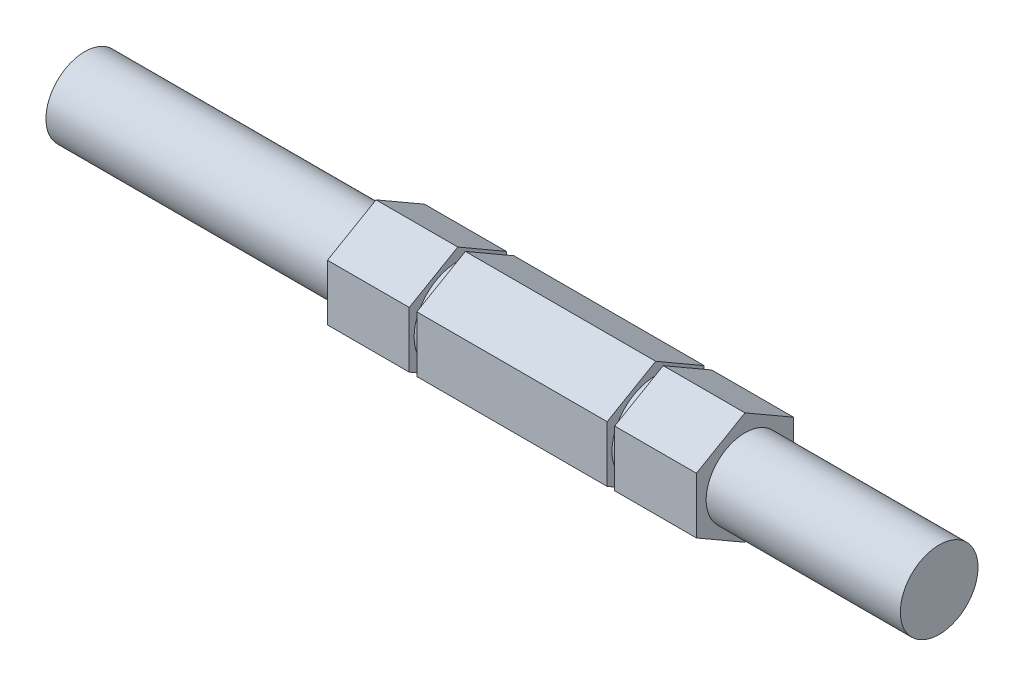
ISO-10303-21;
HEADER;
FILE_DESCRIPTION(('STEP AP214'),'2;1');
FILE_NAME('part.step','',(''),(''),'','','');
FILE_SCHEMA(('AUTOMOTIVE_DESIGN { 1 0 10303 214 1 1 1 1 }'));
ENDSEC;
DATA;
#1=APPLICATION_CONTEXT('core data for automotive mechanical design processes');
#2=APPLICATION_PROTOCOL_DEFINITION('international standard','automotive_design',2000,#1);
#3=PRODUCT_CONTEXT('',#1,'mechanical');
#4=PRODUCT('Part','Part','',(#3));
#5=PRODUCT_RELATED_PRODUCT_CATEGORY('part','',(#4));
#6=PRODUCT_DEFINITION_FORMATION('','',#4);
#7=PRODUCT_DEFINITION_CONTEXT('part definition',#1,'design');
#8=PRODUCT_DEFINITION('design','',#6,#7);
#9=PRODUCT_DEFINITION_SHAPE('','',#8);
#10=(LENGTH_UNIT() NAMED_UNIT(*) SI_UNIT(.MILLI.,.METRE.));
#11=(NAMED_UNIT(*) PLANE_ANGLE_UNIT() SI_UNIT($,.RADIAN.));
#12=(NAMED_UNIT(*) SI_UNIT($,.STERADIAN.) SOLID_ANGLE_UNIT());
#13=UNCERTAINTY_MEASURE_WITH_UNIT(LENGTH_MEASURE(1.E-05),#10,'distance_accuracy_value','');
#14=(GEOMETRIC_REPRESENTATION_CONTEXT(3) GLOBAL_UNCERTAINTY_ASSIGNED_CONTEXT((#13)) GLOBAL_UNIT_ASSIGNED_CONTEXT((#10,
#11,#12)) REPRESENTATION_CONTEXT('',''));
#15=CARTESIAN_POINT('',(0.,0.,0.));
#16=DIRECTION('',(0.,0.,1.));
#17=DIRECTION('',(1.,0.,0.));
#18=AXIS2_PLACEMENT_3D('',#15,#16,#17);
#19=CARTESIAN_POINT('',(48.26,-3.66617420935412,6.35000000000001));
#20=DIRECTION('',(0.,0.866025403784438,-0.5));
#21=DIRECTION('',(0.,0.5,0.866025403784439));
#22=AXIS2_PLACEMENT_3D('',#19,#20,#21);
#23=PLANE('',#22);
#24=DIRECTION('',(-1.,0.,0.));
#25=VECTOR('',#24,1.);
#26=CARTESIAN_POINT('',(48.26,-7.33234841870825,0.));
#27=LINE('',#26,#25);
#28=CARTESIAN_POINT('',(36.576,-7.33234841870825,0.));
#29=VERTEX_POINT('',#28);
#30=CARTESIAN_POINT('',(11.684,-7.33234841870825,0.));
#31=VERTEX_POINT('',#30);
#32=EDGE_CURVE('E165',#29,#31,#27,.T.);
#33=ORIENTED_EDGE('',*,*,#32,.F.);
#34=DIRECTION('',(0.,0.5,0.866025403784439));
#35=VECTOR('',#34,1.);
#36=CARTESIAN_POINT('',(36.576,-3.66617420935412,6.35000000000001));
#37=LINE('',#36,#35);
#38=CARTESIAN_POINT('',(36.576,-3.66617420935413,6.35000000000001));
#39=VERTEX_POINT('',#38);
#40=EDGE_CURVE('E154',#29,#39,#37,.T.);
#41=ORIENTED_EDGE('',*,*,#40,.T.);
#42=DIRECTION('',(-1.,0.,0.));
#43=VECTOR('',#42,1.);
#44=CARTESIAN_POINT('',(48.26,-3.66617420935412,6.35000000000001));
#45=LINE('',#44,#43);
#46=CARTESIAN_POINT('',(11.684,-3.66617420935412,6.35000000000001));
#47=VERTEX_POINT('',#46);
#48=EDGE_CURVE('E163',#39,#47,#45,.T.);
#49=ORIENTED_EDGE('',*,*,#48,.T.);
#50=DIRECTION('',(0.,0.5,0.866025403784439));
#51=VECTOR('',#50,1.);
#52=CARTESIAN_POINT('',(11.684,-3.66617420935412,6.35000000000001));
#53=LINE('',#52,#51);
#54=EDGE_CURVE('E218',#31,#47,#53,.T.);
#55=ORIENTED_EDGE('',*,*,#54,.F.);
#56=EDGE_LOOP('',(#33,#41,#49,#55));
#57=FACE_BOUND('',#56,.T.);
#58=ADVANCED_FACE('F32',(#57),#23,.F.);
#59=CARTESIAN_POINT('',(48.26,-7.33234841870825,0.));
#60=DIRECTION('',(0.,0.866025403784439,0.5));
#61=DIRECTION('',(0.,-0.5,0.866025403784439));
#62=AXIS2_PLACEMENT_3D('',#59,#60,#61);
#63=PLANE('',#62);
#64=DIRECTION('',(-1.,0.,0.));
#65=VECTOR('',#64,1.);
#66=CARTESIAN_POINT('',(48.26,-3.66617420935412,-6.35));
#67=LINE('',#66,#65);
#68=CARTESIAN_POINT('',(36.576,-3.66617420935412,-6.35));
#69=VERTEX_POINT('',#68);
#70=CARTESIAN_POINT('',(11.684,-3.66617420935412,-6.35));
#71=VERTEX_POINT('',#70);
#72=EDGE_CURVE('E201',#69,#71,#67,.T.);
#73=ORIENTED_EDGE('',*,*,#72,.F.);
#74=DIRECTION('',(0.,-0.5,0.866025403784439));
#75=VECTOR('',#74,1.);
#76=CARTESIAN_POINT('',(36.576,-7.33234841870825,0.));
#77=LINE('',#76,#75);
#78=EDGE_CURVE('E167',#69,#29,#77,.T.);
#79=ORIENTED_EDGE('',*,*,#78,.T.);
#80=ORIENTED_EDGE('',*,*,#32,.T.);
#81=DIRECTION('',(0.,-0.5,0.866025403784439));
#82=VECTOR('',#81,1.);
#83=CARTESIAN_POINT('',(11.684,-7.33234841870825,0.));
#84=LINE('',#83,#82);
#85=EDGE_CURVE('E233',#71,#31,#84,.T.);
#86=ORIENTED_EDGE('',*,*,#85,.F.);
#87=EDGE_LOOP('',(#73,#79,#80,#86));
#88=FACE_BOUND('',#87,.T.);
#89=ADVANCED_FACE('F371',(#88),#63,.F.);
#90=CARTESIAN_POINT('',(48.26,-3.66617420935412,-6.35));
#91=DIRECTION('',(0.,0.,1.));
#92=DIRECTION('',(1.,0.,0.));
#93=AXIS2_PLACEMENT_3D('',#90,#91,#92);
#94=PLANE('',#93);
#95=DIRECTION('',(-1.,0.,0.));
#96=VECTOR('',#95,1.);
#97=CARTESIAN_POINT('',(48.26,3.66617420935414,-6.35));
#98=LINE('',#97,#96);
#99=CARTESIAN_POINT('',(36.576,3.66617420935414,-6.35));
#100=VERTEX_POINT('',#99);
#101=CARTESIAN_POINT('',(11.684,3.66617420935414,-6.35));
#102=VERTEX_POINT('',#101);
#103=EDGE_CURVE('E196',#100,#102,#98,.T.);
#104=ORIENTED_EDGE('',*,*,#103,.F.);
#105=DIRECTION('',(0.,-1.,0.));
#106=VECTOR('',#105,1.);
#107=CARTESIAN_POINT('',(36.576,-3.66617420935412,-6.35));
#108=LINE('',#107,#106);
#109=EDGE_CURVE('E322',#100,#69,#108,.T.);
#110=ORIENTED_EDGE('',*,*,#109,.T.);
#111=ORIENTED_EDGE('',*,*,#72,.T.);
#112=DIRECTION('',(0.,-1.,0.));
#113=VECTOR('',#112,1.);
#114=CARTESIAN_POINT('',(11.684,-3.66617420935412,-6.35));
#115=LINE('',#114,#113);
#116=EDGE_CURVE('E225',#102,#71,#115,.T.);
#117=ORIENTED_EDGE('',*,*,#116,.F.);
#118=EDGE_LOOP('',(#104,#110,#111,#117));
#119=FACE_BOUND('',#118,.T.);
#120=ADVANCED_FACE('F377',(#119),#94,.F.);
#121=CARTESIAN_POINT('',(48.26,3.66617420935414,-6.35));
#122=DIRECTION('',(0.,-0.866025403784439,0.5));
#123=DIRECTION('',(0.,-0.5,-0.866025403784439));
#124=AXIS2_PLACEMENT_3D('',#121,#122,#123);
#125=PLANE('',#124);
#126=DIRECTION('',(-1.,0.,0.));
#127=VECTOR('',#126,1.);
#128=CARTESIAN_POINT('',(48.26,7.33234841870826,0.));
#129=LINE('',#128,#127);
#130=CARTESIAN_POINT('',(36.576,7.33234841870826,0.));
#131=VERTEX_POINT('',#130);
#132=CARTESIAN_POINT('',(11.684,7.33234841870826,0.));
#133=VERTEX_POINT('',#132);
#134=EDGE_CURVE('E191',#131,#133,#129,.T.);
#135=ORIENTED_EDGE('',*,*,#134,.F.);
#136=DIRECTION('',(0.,-0.5,-0.866025403784439));
#137=VECTOR('',#136,1.);
#138=CARTESIAN_POINT('',(36.576,3.66617420935414,-6.35));
#139=LINE('',#138,#137);
#140=EDGE_CURVE('E325',#131,#100,#139,.T.);
#141=ORIENTED_EDGE('',*,*,#140,.T.);
#142=ORIENTED_EDGE('',*,*,#103,.T.);
#143=DIRECTION('',(0.,-0.5,-0.866025403784439));
#144=VECTOR('',#143,1.);
#145=CARTESIAN_POINT('',(11.684,3.66617420935414,-6.35));
#146=LINE('',#145,#144);
#147=EDGE_CURVE('E222',#133,#102,#146,.T.);
#148=ORIENTED_EDGE('',*,*,#147,.F.);
#149=EDGE_LOOP('',(#135,#141,#142,#148));
#150=FACE_BOUND('',#149,.T.);
#151=ADVANCED_FACE('F382',(#150),#125,.F.);
#152=CARTESIAN_POINT('',(48.26,7.33234841870826,0.));
#153=DIRECTION('',(0.,-0.866025403784439,-0.5));
#154=DIRECTION('',(0.,0.5,-0.866025403784439));
#155=AXIS2_PLACEMENT_3D('',#152,#153,#154);
#156=PLANE('',#155);
#157=DIRECTION('',(-1.,0.,0.));
#158=VECTOR('',#157,1.);
#159=CARTESIAN_POINT('',(48.26,3.66617420935413,6.35000000000001));
#160=LINE('',#159,#158);
#161=CARTESIAN_POINT('',(36.576,3.66617420935413,6.35000000000001));
#162=VERTEX_POINT('',#161);
#163=CARTESIAN_POINT('',(11.684,3.66617420935413,6.35000000000001));
#164=VERTEX_POINT('',#163);
#165=EDGE_CURVE('E186',#162,#164,#160,.T.);
#166=ORIENTED_EDGE('',*,*,#165,.F.);
#167=DIRECTION('',(0.,0.5,-0.866025403784439));
#168=VECTOR('',#167,1.);
#169=CARTESIAN_POINT('',(36.576,7.33234841870826,0.));
#170=LINE('',#169,#168);
#171=EDGE_CURVE('E46',#162,#131,#170,.T.);
#172=ORIENTED_EDGE('',*,*,#171,.T.);
#173=ORIENTED_EDGE('',*,*,#134,.T.);
#174=DIRECTION('',(0.,0.5,-0.866025403784439));
#175=VECTOR('',#174,1.);
#176=CARTESIAN_POINT('',(11.684,7.33234841870826,0.));
#177=LINE('',#176,#175);
#178=EDGE_CURVE('E215',#164,#133,#177,.T.);
#179=ORIENTED_EDGE('',*,*,#178,.F.);
#180=EDGE_LOOP('',(#166,#172,#173,#179));
#181=FACE_BOUND('',#180,.T.);
#182=ADVANCED_FACE('F220',(#181),#156,.F.);
#183=CARTESIAN_POINT('',(48.26,3.66617420935413,6.35000000000001));
#184=DIRECTION('',(0.,0.,-1.));
#185=DIRECTION('',(0.,1.,0.));
#186=AXIS2_PLACEMENT_3D('',#183,#184,#185);
#187=PLANE('',#186);
#188=ORIENTED_EDGE('',*,*,#48,.F.);
#189=DIRECTION('',(0.,1.,0.));
#190=VECTOR('',#189,1.);
#191=CARTESIAN_POINT('',(36.576,3.66617420935413,6.35000000000001));
#192=LINE('',#191,#190);
#193=EDGE_CURVE('E39',#39,#162,#192,.T.);
#194=ORIENTED_EDGE('',*,*,#193,.T.);
#195=ORIENTED_EDGE('',*,*,#165,.T.);
#196=DIRECTION('',(0.,1.,0.));
#197=VECTOR('',#196,1.);
#198=CARTESIAN_POINT('',(11.684,3.66617420935413,6.35000000000001));
#199=LINE('',#198,#197);
#200=EDGE_CURVE('E159',#47,#164,#199,.T.);
#201=ORIENTED_EDGE('',*,*,#200,.F.);
#202=EDGE_LOOP('',(#188,#194,#195,#201));
#203=FACE_BOUND('',#202,.T.);
#204=ADVANCED_FACE('F170',(#203),#187,.F.);
#205=CARTESIAN_POINT('',(11.684,0.,-5.715));
#206=DIRECTION('',(-1.,0.,0.));
#207=DIRECTION('',(0.,0.,1.));
#208=AXIS2_PLACEMENT_3D('',#205,#206,#207);
#209=PLANE('',#208);
#210=CARTESIAN_POINT('',(11.684,0.,0.));
#211=DIRECTION('',(-1.,0.,0.));
#212=DIRECTION('',(0.,0.,1.));
#213=AXIS2_PLACEMENT_3D('',#210,#211,#212);
#214=CIRCLE('',#213,5.715);
#215=CARTESIAN_POINT('',(11.684,0.,5.715));
#216=VERTEX_POINT('',#215);
#217=EDGE_CURVE('E303',#216,#216,#214,.T.);
#218=ORIENTED_EDGE('',*,*,#217,.F.);
#219=EDGE_LOOP('',(#218));
#220=FACE_BOUND('',#219,.T.);
#221=ORIENTED_EDGE('',*,*,#54,.T.);
#222=ORIENTED_EDGE('',*,*,#200,.T.);
#223=ORIENTED_EDGE('',*,*,#178,.T.);
#224=ORIENTED_EDGE('',*,*,#147,.T.);
#225=ORIENTED_EDGE('',*,*,#116,.T.);
#226=ORIENTED_EDGE('',*,*,#85,.T.);
#227=EDGE_LOOP('',(#221,#222,#223,#224,#225,#226));
#228=FACE_BOUND('',#227,.T.);
#229=ADVANCED_FACE('F213',(#220,#228),#209,.T.);
#230=CARTESIAN_POINT('',(10.6934,0.,-7.93381997086933));
#231=DIRECTION('',(1.,0.,0.));
#232=DIRECTION('',(0.,0.,-1.));
#233=AXIS2_PLACEMENT_3D('',#230,#231,#232);
#234=PLANE('',#233);
#235=CARTESIAN_POINT('',(10.6934,0.,0.));
#236=DIRECTION('',(-1.,0.,0.));
#237=DIRECTION('',(0.,0.,1.));
#238=AXIS2_PLACEMENT_3D('',#235,#236,#237);
#239=CIRCLE('',#238,5.715);
#240=CARTESIAN_POINT('',(10.6934,0.,5.715));
#241=VERTEX_POINT('',#240);
#242=EDGE_CURVE('E306',#241,#241,#239,.T.);
#243=ORIENTED_EDGE('',*,*,#242,.T.);
#244=EDGE_LOOP('',(#243));
#245=FACE_BOUND('',#244,.T.);
#246=DIRECTION('',(0.,-0.5,-0.866025403784439));
#247=VECTOR('',#246,1.);
#248=CARTESIAN_POINT('',(10.6934,-3.66617420935412,6.35000000000001));
#249=LINE('',#248,#247);
#250=CARTESIAN_POINT('',(10.6934,-3.66617420935413,6.35000000000001));
#251=VERTEX_POINT('',#250);
#252=CARTESIAN_POINT('',(10.6934,-7.33234841870825,0.));
#253=VERTEX_POINT('',#252);
#254=EDGE_CURVE('E223',#251,#253,#249,.T.);
#255=ORIENTED_EDGE('',*,*,#254,.T.);
#256=DIRECTION('',(0.,0.5,-0.866025403784439));
#257=VECTOR('',#256,1.);
#258=CARTESIAN_POINT('',(10.6934,-7.33234841870825,0.));
#259=LINE('',#258,#257);
#260=CARTESIAN_POINT('',(10.6934,-3.66617420935412,-6.35));
#261=VERTEX_POINT('',#260);
#262=EDGE_CURVE('E227',#253,#261,#259,.T.);
#263=ORIENTED_EDGE('',*,*,#262,.T.);
#264=DIRECTION('',(0.,1.,0.));
#265=VECTOR('',#264,1.);
#266=CARTESIAN_POINT('',(10.6934,-3.66617420935412,-6.35));
#267=LINE('',#266,#265);
#268=CARTESIAN_POINT('',(10.6934,3.66617420935414,-6.35));
#269=VERTEX_POINT('',#268);
#270=EDGE_CURVE('E296',#261,#269,#267,.T.);
#271=ORIENTED_EDGE('',*,*,#270,.T.);
#272=DIRECTION('',(0.,0.5,0.866025403784439));
#273=VECTOR('',#272,1.);
#274=CARTESIAN_POINT('',(10.6934,3.66617420935414,-6.35));
#275=LINE('',#274,#273);
#276=CARTESIAN_POINT('',(10.6934,7.33234841870826,0.));
#277=VERTEX_POINT('',#276);
#278=EDGE_CURVE('E297',#269,#277,#275,.T.);
#279=ORIENTED_EDGE('',*,*,#278,.T.);
#280=DIRECTION('',(0.,-0.5,0.866025403784439));
#281=VECTOR('',#280,1.);
#282=CARTESIAN_POINT('',(10.6934,7.33234841870826,0.));
#283=LINE('',#282,#281);
#284=CARTESIAN_POINT('',(10.6934,3.66617420935413,6.35000000000001));
#285=VERTEX_POINT('',#284);
#286=EDGE_CURVE('E301',#277,#285,#283,.T.);
#287=ORIENTED_EDGE('',*,*,#286,.T.);
#288=DIRECTION('',(0.,-1.,0.));
#289=VECTOR('',#288,1.);
#290=CARTESIAN_POINT('',(10.6934,3.66617420935413,6.35000000000001));
#291=LINE('',#290,#289);
#292=EDGE_CURVE('E208',#285,#251,#291,.T.);
#293=ORIENTED_EDGE('',*,*,#292,.T.);
#294=EDGE_LOOP('',(#255,#263,#271,#279,#287,#293));
#295=FACE_BOUND('',#294,.T.);
#296=ADVANCED_FACE('F291',(#245,#295),#234,.T.);
#297=CARTESIAN_POINT('',(-57.5945603764723,0.,0.));
#298=DIRECTION('',(-1.,0.,0.));
#299=DIRECTION('',(0.,0.,1.));
#300=AXIS2_PLACEMENT_3D('',#297,#298,#299);
#301=CYLINDRICAL_SURFACE('',#300,5.715);
#302=ORIENTED_EDGE('',*,*,#217,.T.);
#303=EDGE_LOOP('',(#302));
#304=FACE_BOUND('',#303,.T.);
#305=ORIENTED_EDGE('',*,*,#242,.F.);
#306=EDGE_LOOP('',(#305));
#307=FACE_BOUND('',#306,.T.);
#308=ADVANCED_FACE('F439',(#304,#307),#301,.T.);
#309=CARTESIAN_POINT('',(-38.1,0.,0.));
#310=DIRECTION('',(-1.,0.,0.));
#311=DIRECTION('',(0.,0.,1.));
#312=AXIS2_PLACEMENT_3D('',#309,#310,#311);
#313=PLANE('',#312);
#314=CARTESIAN_POINT('',(-38.1,0.,0.));
#315=DIRECTION('',(-1.,0.,0.));
#316=DIRECTION('',(0.,0.,1.));
#317=AXIS2_PLACEMENT_3D('',#314,#315,#316);
#318=CIRCLE('',#317,5.08);
#319=CARTESIAN_POINT('',(-38.1,0.,-5.08));
#320=VERTEX_POINT('',#319);
#321=EDGE_CURVE('E240',#320,#320,#318,.T.);
#322=ORIENTED_EDGE('',*,*,#321,.T.);
#323=EDGE_LOOP('',(#322));
#324=FACE_BOUND('',#323,.T.);
#325=ADVANCED_FACE('F435',(#324),#313,.T.);
#326=CARTESIAN_POINT('',(-38.1,0.,0.));
#327=DIRECTION('',(1.,0.,0.));
#328=DIRECTION('',(0.,0.,-1.));
#329=AXIS2_PLACEMENT_3D('',#326,#327,#328);
#330=CYLINDRICAL_SURFACE('',#329,5.08);
#331=CARTESIAN_POINT('',(0.,0.,0.));
#332=DIRECTION('',(1.,0.,0.));
#333=DIRECTION('',(0.,0.,-1.));
#334=AXIS2_PLACEMENT_3D('',#331,#332,#333);
#335=CIRCLE('',#334,5.08);
#336=CARTESIAN_POINT('',(0.,0.,-5.08));
#337=VERTEX_POINT('',#336);
#338=EDGE_CURVE('E205',#337,#337,#335,.F.);
#339=CARTESIAN_POINT('',(-38.1,0.,-5.08));
#340=CARTESIAN_POINT('',(-37.703125,0.,-5.08));
#341=CARTESIAN_POINT('',(-37.30625,0.,-5.08));
#342=CARTESIAN_POINT('',(-36.5125,0.,-5.08));
#343=CARTESIAN_POINT('',(-36.115625,0.,-5.08));
#344=CARTESIAN_POINT('',(-35.321875,0.,-5.08));
#345=CARTESIAN_POINT('',(-34.925,0.,-5.08));
#346=CARTESIAN_POINT('',(-34.13125,0.,-5.08));
#347=CARTESIAN_POINT('',(-33.734375,0.,-5.08));
#348=CARTESIAN_POINT('',(-32.940625,0.,-5.08));
#349=CARTESIAN_POINT('',(-32.54375,0.,-5.08));
#350=CARTESIAN_POINT('',(-31.75,0.,-5.08));
#351=CARTESIAN_POINT('',(-31.353125,0.,-5.08));
#352=CARTESIAN_POINT('',(-30.559375,0.,-5.08));
#353=CARTESIAN_POINT('',(-30.1625,0.,-5.08));
#354=CARTESIAN_POINT('',(-29.36875,0.,-5.08));
#355=CARTESIAN_POINT('',(-28.971875,0.,-5.08));
#356=CARTESIAN_POINT('',(-28.178125,0.,-5.08));
#357=CARTESIAN_POINT('',(-27.78125,0.,-5.08));
#358=CARTESIAN_POINT('',(-26.9875,0.,-5.08));
#359=CARTESIAN_POINT('',(-26.590625,0.,-5.08));
#360=CARTESIAN_POINT('',(-25.796875,0.,-5.08));
#361=CARTESIAN_POINT('',(-25.4,0.,-5.08));
#362=CARTESIAN_POINT('',(-24.60625,0.,-5.08));
#363=CARTESIAN_POINT('',(-24.209375,0.,-5.08));
#364=CARTESIAN_POINT('',(-23.415625,0.,-5.08));
#365=CARTESIAN_POINT('',(-23.01875,0.,-5.08));
#366=CARTESIAN_POINT('',(-22.225,0.,-5.08));
#367=CARTESIAN_POINT('',(-21.828125,0.,-5.08));
#368=CARTESIAN_POINT('',(-21.034375,0.,-5.08));
#369=CARTESIAN_POINT('',(-20.6375,0.,-5.08));
#370=CARTESIAN_POINT('',(-19.84375,0.,-5.08));
#371=CARTESIAN_POINT('',(-19.446875,0.,-5.08));
#372=CARTESIAN_POINT('',(-18.653125,0.,-5.08));
#373=CARTESIAN_POINT('',(-18.25625,0.,-5.08));
#374=CARTESIAN_POINT('',(-17.4625,0.,-5.08));
#375=CARTESIAN_POINT('',(-17.065625,0.,-5.08));
#376=CARTESIAN_POINT('',(-16.271875,0.,-5.08));
#377=CARTESIAN_POINT('',(-15.875,0.,-5.08));
#378=CARTESIAN_POINT('',(-15.08125,0.,-5.08));
#379=CARTESIAN_POINT('',(-14.684375,0.,-5.08));
#380=CARTESIAN_POINT('',(-13.890625,0.,-5.08));
#381=CARTESIAN_POINT('',(-13.49375,0.,-5.08));
#382=CARTESIAN_POINT('',(-12.7,0.,-5.08));
#383=CARTESIAN_POINT('',(-12.303125,0.,-5.08));
#384=CARTESIAN_POINT('',(-11.509375,0.,-5.08));
#385=CARTESIAN_POINT('',(-11.1125,0.,-5.08));
#386=CARTESIAN_POINT('',(-10.31875,0.,-5.08));
#387=CARTESIAN_POINT('',(-9.921875,0.,-5.08));
#388=CARTESIAN_POINT('',(-9.128125,0.,-5.08));
#389=CARTESIAN_POINT('',(-8.73125,0.,-5.08));
#390=CARTESIAN_POINT('',(-7.9375,0.,-5.08));
#391=CARTESIAN_POINT('',(-7.540625,0.,-5.08));
#392=CARTESIAN_POINT('',(-6.746875,0.,-5.08));
#393=CARTESIAN_POINT('',(-6.35,0.,-5.08));
#394=CARTESIAN_POINT('',(-5.55625,0.,-5.08));
#395=CARTESIAN_POINT('',(-5.159375,0.,-5.08));
#396=CARTESIAN_POINT('',(-4.365625,0.,-5.08));
#397=CARTESIAN_POINT('',(-3.96875,0.,-5.08));
#398=CARTESIAN_POINT('',(-3.175,0.,-5.08));
#399=CARTESIAN_POINT('',(-2.778125,0.,-5.08));
#400=CARTESIAN_POINT('',(-1.984375,0.,-5.08));
#401=CARTESIAN_POINT('',(-1.5875,0.,-5.08));
#402=CARTESIAN_POINT('',(-0.79375,0.,-5.08));
#403=CARTESIAN_POINT('',(-0.396875,0.,-5.08));
#404=CARTESIAN_POINT('',(0.,0.,-5.08));
#405=B_SPLINE_CURVE_WITH_KNOTS('',3,(#339,#340,#341,#342,#343,#344,#345,#346,#347,#348,#349,
#350,#351,#352,#353,#354,#355,#356,#357,#358,#359,#360,#361,#362,#363,#364,#365,#366,#367,#368,
#369,#370,#371,#372,#373,#374,#375,#376,#377,#378,#379,#380,#381,#382,#383,#384,#385,#386,#387,
#388,#389,#390,#391,#392,#393,#394,#395,#396,#397,#398,#399,#400,#401,#402,#403,#404),
.UNSPECIFIED.,.F.,.F.,(4,2,2,2,2,2,2,2,2,2,2,2,2,2,2,2,2,2,2,2,2,2,2,2,2,2,2,2,2,2,2,2,4),(0.,
1.19062499999999,2.38124999999999,3.571875,4.7625,5.953125,7.14375,8.33437499999999,9.525,
10.715625,11.90625,13.096875,14.2875,15.478125,16.66875,17.859375,19.05,20.240625,21.43125,
22.621875,23.8125,25.003125,26.19375,27.384375,28.575,29.765625,30.95625,32.146875,33.3375,
34.528125,35.71875,36.909375,38.1),.UNSPECIFIED.);
#406=EDGE_CURVE('BSEAM429',#320,#337,#405,.T.);
#407=ORIENTED_EDGE('',*,*,#321,.F.);
#408=ORIENTED_EDGE('',*,*,#338,.T.);
#409=ORIENTED_EDGE('',*,*,#406,.T.);
#410=ORIENTED_EDGE('',*,*,#406,.F.);
#411=EDGE_LOOP('',(#407,#409,#408,#410));
#412=FACE_BOUND('',#411,.T.);
#413=ADVANCED_FACE('F429',(#412),#330,.T.);
#414=CARTESIAN_POINT('',(0.,0.,0.));
#415=DIRECTION('',(1.,0.,0.));
#416=DIRECTION('',(0.,0.,-1.));
#417=AXIS2_PLACEMENT_3D('',#414,#415,#416);
#418=PLANE('',#417);
#419=DIRECTION('',(0.,-0.5,-0.866025403784439));
#420=VECTOR('',#419,1.);
#421=CARTESIAN_POINT('',(0.,-3.66617420935412,6.35000000000001));
#422=LINE('',#421,#420);
#423=CARTESIAN_POINT('',(0.,-3.66617420935412,6.35000000000001));
#424=VERTEX_POINT('',#423);
#425=CARTESIAN_POINT('',(0.,-7.33234841870825,0.));
#426=VERTEX_POINT('',#425);
#427=EDGE_CURVE('E245',#424,#426,#422,.T.);
#428=ORIENTED_EDGE('',*,*,#427,.F.);
#429=DIRECTION('',(0.,-1.,0.));
#430=VECTOR('',#429,1.);
#431=CARTESIAN_POINT('',(0.,3.66617420935413,6.35000000000001));
#432=LINE('',#431,#430);
#433=CARTESIAN_POINT('',(0.,3.66617420935413,6.35000000000001));
#434=VERTEX_POINT('',#433);
#435=EDGE_CURVE('E180',#434,#424,#432,.T.);
#436=ORIENTED_EDGE('',*,*,#435,.F.);
#437=DIRECTION('',(0.,-0.5,0.866025403784439));
#438=VECTOR('',#437,1.);
#439=CARTESIAN_POINT('',(0.,7.33234841870826,0.));
#440=LINE('',#439,#438);
#441=CARTESIAN_POINT('',(0.,7.33234841870826,0.));
#442=VERTEX_POINT('',#441);
#443=EDGE_CURVE('E268',#442,#434,#440,.T.);
#444=ORIENTED_EDGE('',*,*,#443,.F.);
#445=DIRECTION('',(0.,0.5,0.866025403784439));
#446=VECTOR('',#445,1.);
#447=CARTESIAN_POINT('',(0.,3.66617420935414,-6.35));
#448=LINE('',#447,#446);
#449=CARTESIAN_POINT('',(0.,3.66617420935414,-6.35));
#450=VERTEX_POINT('',#449);
#451=EDGE_CURVE('E266',#450,#442,#448,.T.);
#452=ORIENTED_EDGE('',*,*,#451,.F.);
#453=DIRECTION('',(0.,1.,0.));
#454=VECTOR('',#453,1.);
#455=CARTESIAN_POINT('',(0.,-3.66617420935412,-6.35));
#456=LINE('',#455,#454);
#457=CARTESIAN_POINT('',(0.,-3.66617420935412,-6.35));
#458=VERTEX_POINT('',#457);
#459=EDGE_CURVE('E263',#458,#450,#456,.T.);
#460=ORIENTED_EDGE('',*,*,#459,.F.);
#461=DIRECTION('',(0.,0.5,-0.866025403784439));
#462=VECTOR('',#461,1.);
#463=CARTESIAN_POINT('',(0.,-7.33234841870825,0.));
#464=LINE('',#463,#462);
#465=EDGE_CURVE('E260',#426,#458,#464,.T.);
#466=ORIENTED_EDGE('',*,*,#465,.F.);
#467=EDGE_LOOP('',(#428,#436,#444,#452,#460,#466));
#468=FACE_BOUND('',#467,.T.);
#469=ORIENTED_EDGE('',*,*,#338,.F.);
#470=EDGE_LOOP('',(#469));
#471=FACE_BOUND('',#470,.T.);
#472=ADVANCED_FACE('F282',(#468,#471),#418,.F.);
#473=ORIENTED_EDGE('',*,*,#292,.F.);
#474=EDGE_CURVE('E176',#285,#434,#160,.T.);
#475=ORIENTED_EDGE('',*,*,#474,.T.);
#476=ORIENTED_EDGE('',*,*,#435,.T.);
#477=EDGE_CURVE('E173',#251,#424,#45,.T.);
#478=ORIENTED_EDGE('',*,*,#477,.F.);
#479=EDGE_LOOP('',(#473,#475,#476,#478));
#480=FACE_BOUND('',#479,.T.);
#481=ADVANCED_FACE('F279',(#480),#187,.F.);
#482=ORIENTED_EDGE('',*,*,#286,.F.);
#483=EDGE_CURVE('E185',#277,#442,#129,.T.);
#484=ORIENTED_EDGE('',*,*,#483,.T.);
#485=ORIENTED_EDGE('',*,*,#443,.T.);
#486=ORIENTED_EDGE('',*,*,#474,.F.);
#487=EDGE_LOOP('',(#482,#484,#485,#486));
#488=FACE_BOUND('',#487,.T.);
#489=ADVANCED_FACE('F396',(#488),#156,.F.);
#490=ORIENTED_EDGE('',*,*,#278,.F.);
#491=EDGE_CURVE('E190',#269,#450,#98,.T.);
#492=ORIENTED_EDGE('',*,*,#491,.T.);
#493=ORIENTED_EDGE('',*,*,#451,.T.);
#494=ORIENTED_EDGE('',*,*,#483,.F.);
#495=EDGE_LOOP('',(#490,#492,#493,#494));
#496=FACE_BOUND('',#495,.T.);
#497=ADVANCED_FACE('F391',(#496),#125,.F.);
#498=ORIENTED_EDGE('',*,*,#270,.F.);
#499=EDGE_CURVE('E195',#261,#458,#67,.T.);
#500=ORIENTED_EDGE('',*,*,#499,.T.);
#501=ORIENTED_EDGE('',*,*,#459,.T.);
#502=ORIENTED_EDGE('',*,*,#491,.F.);
#503=EDGE_LOOP('',(#498,#500,#501,#502));
#504=FACE_BOUND('',#503,.T.);
#505=ADVANCED_FACE('F385',(#504),#94,.F.);
#506=ORIENTED_EDGE('',*,*,#262,.F.);
#507=EDGE_CURVE('E200',#253,#426,#27,.T.);
#508=ORIENTED_EDGE('',*,*,#507,.T.);
#509=ORIENTED_EDGE('',*,*,#465,.T.);
#510=ORIENTED_EDGE('',*,*,#499,.F.);
#511=EDGE_LOOP('',(#506,#508,#509,#510));
#512=FACE_BOUND('',#511,.T.);
#513=ADVANCED_FACE('F295',(#512),#63,.F.);
#514=ORIENTED_EDGE('',*,*,#254,.F.);
#515=ORIENTED_EDGE('',*,*,#477,.T.);
#516=ORIENTED_EDGE('',*,*,#427,.T.);
#517=ORIENTED_EDGE('',*,*,#507,.F.);
#518=EDGE_LOOP('',(#514,#515,#516,#517));
#519=FACE_BOUND('',#518,.T.);
#520=ADVANCED_FACE('F288',(#519),#23,.F.);
#521=CARTESIAN_POINT('',(37.5666,0.,-7.93381997086933));
#522=DIRECTION('',(1.,0.,0.));
#523=DIRECTION('',(0.,0.,-1.));
#524=AXIS2_PLACEMENT_3D('',#521,#522,#523);
#525=PLANE('',#524);
#526=CARTESIAN_POINT('',(37.5666,0.,0.));
#527=DIRECTION('',(-1.,0.,0.));
#528=DIRECTION('',(0.,0.,1.));
#529=AXIS2_PLACEMENT_3D('',#526,#527,#528);
#530=CIRCLE('',#529,5.715);
#531=CARTESIAN_POINT('',(37.5666,0.,5.715));
#532=VERTEX_POINT('',#531);
#533=EDGE_CURVE('E332',#532,#532,#530,.T.);
#534=ORIENTED_EDGE('',*,*,#533,.F.);
#535=EDGE_LOOP('',(#534));
#536=FACE_BOUND('',#535,.T.);
#537=DIRECTION('',(0.,-1.,0.));
#538=VECTOR('',#537,1.);
#539=CARTESIAN_POINT('',(37.5666,3.66617420935413,6.35000000000001));
#540=LINE('',#539,#538);
#541=CARTESIAN_POINT('',(37.5666,3.66617420935413,6.35000000000001));
#542=VERTEX_POINT('',#541);
#543=CARTESIAN_POINT('',(37.5666,-3.66617420935412,6.35000000000001));
#544=VERTEX_POINT('',#543);
#545=EDGE_CURVE('E11',#542,#544,#540,.T.);
#546=ORIENTED_EDGE('',*,*,#545,.F.);
#547=DIRECTION('',(0.,-0.5,0.866025403784439));
#548=VECTOR('',#547,1.);
#549=CARTESIAN_POINT('',(37.5666,7.33234841870826,0.));
#550=LINE('',#549,#548);
#551=CARTESIAN_POINT('',(37.5666,7.33234841870826,0.));
#552=VERTEX_POINT('',#551);
#553=EDGE_CURVE('E166',#552,#542,#550,.T.);
#554=ORIENTED_EDGE('',*,*,#553,.F.);
#555=DIRECTION('',(0.,0.5,0.866025403784439));
#556=VECTOR('',#555,1.);
#557=CARTESIAN_POINT('',(37.5666,3.66617420935414,-6.35));
#558=LINE('',#557,#556);
#559=CARTESIAN_POINT('',(37.5666,3.66617420935414,-6.35));
#560=VERTEX_POINT('',#559);
#561=EDGE_CURVE('E316',#560,#552,#558,.T.);
#562=ORIENTED_EDGE('',*,*,#561,.F.);
#563=DIRECTION('',(0.,1.,0.));
#564=VECTOR('',#563,1.);
#565=CARTESIAN_POINT('',(37.5666,-3.66617420935412,-6.35));
#566=LINE('',#565,#564);
#567=CARTESIAN_POINT('',(37.5666,-3.66617420935412,-6.35));
#568=VERTEX_POINT('',#567);
#569=EDGE_CURVE('E313',#568,#560,#566,.T.);
#570=ORIENTED_EDGE('',*,*,#569,.F.);
#571=DIRECTION('',(0.,0.5,-0.866025403784439));
#572=VECTOR('',#571,1.);
#573=CARTESIAN_POINT('',(37.5666,-7.33234841870825,0.));
#574=LINE('',#573,#572);
#575=CARTESIAN_POINT('',(37.5666,-7.33234841870825,0.));
#576=VERTEX_POINT('',#575);
#577=EDGE_CURVE('E310',#576,#568,#574,.T.);
#578=ORIENTED_EDGE('',*,*,#577,.F.);
#579=DIRECTION('',(0.,-0.5,-0.866025403784439));
#580=VECTOR('',#579,1.);
#581=CARTESIAN_POINT('',(37.5666,-3.66617420935412,6.35000000000001));
#582=LINE('',#581,#580);
#583=EDGE_CURVE('E54',#544,#576,#582,.T.);
#584=ORIENTED_EDGE('',*,*,#583,.F.);
#585=EDGE_LOOP('',(#546,#554,#562,#570,#578,#584));
#586=FACE_BOUND('',#585,.T.);
#587=ADVANCED_FACE('F338',(#536,#586),#525,.F.);
#588=CARTESIAN_POINT('',(36.576,0.,-5.715));
#589=DIRECTION('',(-1.,0.,0.));
#590=DIRECTION('',(0.,0.,1.));
#591=AXIS2_PLACEMENT_3D('',#588,#589,#590);
#592=PLANE('',#591);
#593=CARTESIAN_POINT('',(36.576,0.,0.));
#594=DIRECTION('',(-1.,0.,0.));
#595=DIRECTION('',(0.,0.,1.));
#596=AXIS2_PLACEMENT_3D('',#593,#594,#595);
#597=CIRCLE('',#596,5.715);
#598=CARTESIAN_POINT('',(36.576,0.,5.715));
#599=VERTEX_POINT('',#598);
#600=EDGE_CURVE('E329',#599,#599,#597,.T.);
#601=ORIENTED_EDGE('',*,*,#600,.T.);
#602=EDGE_LOOP('',(#601));
#603=FACE_BOUND('',#602,.T.);
#604=ORIENTED_EDGE('',*,*,#78,.F.);
#605=ORIENTED_EDGE('',*,*,#109,.F.);
#606=ORIENTED_EDGE('',*,*,#140,.F.);
#607=ORIENTED_EDGE('',*,*,#171,.F.);
#608=ORIENTED_EDGE('',*,*,#193,.F.);
#609=ORIENTED_EDGE('',*,*,#40,.F.);
#610=EDGE_LOOP('',(#604,#605,#606,#607,#608,#609));
#611=FACE_BOUND('',#610,.T.);
#612=ADVANCED_FACE('F153',(#603,#611),#592,.F.);
#613=CARTESIAN_POINT('',(-57.5945603764723,0.,0.));
#614=DIRECTION('',(-1.,0.,0.));
#615=DIRECTION('',(0.,0.,1.));
#616=AXIS2_PLACEMENT_3D('',#613,#614,#615);
#617=CYLINDRICAL_SURFACE('',#616,5.715);
#618=ORIENTED_EDGE('',*,*,#600,.F.);
#619=EDGE_LOOP('',(#618));
#620=FACE_BOUND('',#619,.T.);
#621=ORIENTED_EDGE('',*,*,#533,.T.);
#622=EDGE_LOOP('',(#621));
#623=FACE_BOUND('',#622,.T.);
#624=ADVANCED_FACE('F336',(#620,#623),#617,.T.);
#625=CARTESIAN_POINT('',(73.66,0.,0.));
#626=DIRECTION('',(1.,0.,0.));
#627=DIRECTION('',(0.,0.,-1.));
#628=AXIS2_PLACEMENT_3D('',#625,#626,#627);
#629=PLANE('',#628);
#630=CARTESIAN_POINT('',(73.66,0.,0.));
#631=DIRECTION('',(1.,0.,0.));
#632=DIRECTION('',(0.,0.,-1.));
#633=AXIS2_PLACEMENT_3D('',#630,#631,#632);
#634=CIRCLE('',#633,5.08);
#635=CARTESIAN_POINT('',(73.66,0.,-5.08));
#636=VERTEX_POINT('',#635);
#637=EDGE_CURVE('E237',#636,#636,#634,.T.);
#638=ORIENTED_EDGE('',*,*,#637,.T.);
#639=EDGE_LOOP('',(#638));
#640=FACE_BOUND('',#639,.T.);
#641=ADVANCED_FACE('F443',(#640),#629,.T.);
#642=CARTESIAN_POINT('',(73.66,0.,0.));
#643=DIRECTION('',(-1.,0.,0.));
#644=DIRECTION('',(0.,0.,1.));
#645=AXIS2_PLACEMENT_3D('',#642,#643,#644);
#646=CYLINDRICAL_SURFACE('',#645,5.08);
#647=ORIENTED_EDGE('',*,*,#637,.F.);
#648=EDGE_LOOP('',(#647));
#649=FACE_BOUND('',#648,.T.);
#650=CARTESIAN_POINT('',(48.26,0.,0.));
#651=DIRECTION('',(1.,0.,0.));
#652=DIRECTION('',(0.,0.,-1.));
#653=AXIS2_PLACEMENT_3D('',#650,#651,#652);
#654=CIRCLE('',#653,5.08);
#655=CARTESIAN_POINT('',(48.26,0.,-5.08));
#656=VERTEX_POINT('',#655);
#657=EDGE_CURVE('E236',#656,#656,#654,.T.);
#658=ORIENTED_EDGE('',*,*,#657,.T.);
#659=EDGE_LOOP('',(#658));
#660=FACE_BOUND('',#659,.T.);
#661=ADVANCED_FACE('F432',(#649,#660),#646,.T.);
#662=CARTESIAN_POINT('',(48.26,0.,0.));
#663=DIRECTION('',(1.,0.,0.));
#664=DIRECTION('',(0.,0.,-1.));
#665=AXIS2_PLACEMENT_3D('',#662,#663,#664);
#666=PLANE('',#665);
#667=DIRECTION('',(0.,-0.5,-0.866025403784439));
#668=VECTOR('',#667,1.);
#669=CARTESIAN_POINT('',(48.26,-3.66617420935412,6.35000000000001));
#670=LINE('',#669,#668);
#671=CARTESIAN_POINT('',(48.26,-3.66617420935412,6.35000000000001));
#672=VERTEX_POINT('',#671);
#673=CARTESIAN_POINT('',(48.26,-7.33234841870825,0.));
#674=VERTEX_POINT('',#673);
#675=EDGE_CURVE('E246',#672,#674,#670,.T.);
#676=ORIENTED_EDGE('',*,*,#675,.T.);
#677=DIRECTION('',(0.,0.5,-0.866025403784439));
#678=VECTOR('',#677,1.);
#679=CARTESIAN_POINT('',(48.26,-7.33234841870825,0.));
#680=LINE('',#679,#678);
#681=CARTESIAN_POINT('',(48.26,-3.66617420935412,-6.35));
#682=VERTEX_POINT('',#681);
#683=EDGE_CURVE('E249',#674,#682,#680,.T.);
#684=ORIENTED_EDGE('',*,*,#683,.T.);
#685=DIRECTION('',(0.,1.,0.));
#686=VECTOR('',#685,1.);
#687=CARTESIAN_POINT('',(48.26,-3.66617420935412,-6.35));
#688=LINE('',#687,#686);
#689=CARTESIAN_POINT('',(48.26,3.66617420935414,-6.35));
#690=VERTEX_POINT('',#689);
#691=EDGE_CURVE('E251',#682,#690,#688,.T.);
#692=ORIENTED_EDGE('',*,*,#691,.T.);
#693=DIRECTION('',(0.,0.5,0.866025403784439));
#694=VECTOR('',#693,1.);
#695=CARTESIAN_POINT('',(48.26,3.66617420935414,-6.35));
#696=LINE('',#695,#694);
#697=CARTESIAN_POINT('',(48.26,7.33234841870826,0.));
#698=VERTEX_POINT('',#697);
#699=EDGE_CURVE('E253',#690,#698,#696,.T.);
#700=ORIENTED_EDGE('',*,*,#699,.T.);
#701=DIRECTION('',(0.,-0.5,0.866025403784439));
#702=VECTOR('',#701,1.);
#703=CARTESIAN_POINT('',(48.26,7.33234841870826,0.));
#704=LINE('',#703,#702);
#705=CARTESIAN_POINT('',(48.26,3.66617420935413,6.35000000000001));
#706=VERTEX_POINT('',#705);
#707=EDGE_CURVE('E255',#698,#706,#704,.T.);
#708=ORIENTED_EDGE('',*,*,#707,.T.);
#709=DIRECTION('',(0.,-1.,0.));
#710=VECTOR('',#709,1.);
#711=CARTESIAN_POINT('',(48.26,3.66617420935413,6.35000000000001));
#712=LINE('',#711,#710);
#713=EDGE_CURVE('E177',#706,#672,#712,.T.);
#714=ORIENTED_EDGE('',*,*,#713,.T.);
#715=EDGE_LOOP('',(#676,#684,#692,#700,#708,#714));
#716=FACE_BOUND('',#715,.T.);
#717=ORIENTED_EDGE('',*,*,#657,.F.);
#718=EDGE_LOOP('',(#717));
#719=FACE_BOUND('',#718,.T.);
#720=ADVANCED_FACE('F352',(#716,#719),#666,.T.);
#721=EDGE_CURVE('E182',#706,#542,#160,.T.);
#722=ORIENTED_EDGE('',*,*,#721,.T.);
#723=ORIENTED_EDGE('',*,*,#545,.T.);
#724=EDGE_CURVE('E172',#672,#544,#45,.T.);
#725=ORIENTED_EDGE('',*,*,#724,.F.);
#726=ORIENTED_EDGE('',*,*,#713,.F.);
#727=EDGE_LOOP('',(#722,#723,#725,#726));
#728=FACE_BOUND('',#727,.T.);
#729=ADVANCED_FACE('F349',(#728),#187,.F.);
#730=EDGE_CURVE('E187',#698,#552,#129,.T.);
#731=ORIENTED_EDGE('',*,*,#730,.T.);
#732=ORIENTED_EDGE('',*,*,#553,.T.);
#733=ORIENTED_EDGE('',*,*,#721,.F.);
#734=ORIENTED_EDGE('',*,*,#707,.F.);
#735=EDGE_LOOP('',(#731,#732,#733,#734));
#736=FACE_BOUND('',#735,.T.);
#737=ADVANCED_FACE('F345',(#736),#156,.F.);
#738=EDGE_CURVE('E192',#690,#560,#98,.T.);
#739=ORIENTED_EDGE('',*,*,#738,.T.);
#740=ORIENTED_EDGE('',*,*,#561,.T.);
#741=ORIENTED_EDGE('',*,*,#730,.F.);
#742=ORIENTED_EDGE('',*,*,#699,.F.);
#743=EDGE_LOOP('',(#739,#740,#741,#742));
#744=FACE_BOUND('',#743,.T.);
#745=ADVANCED_FACE('F359',(#744),#125,.F.);
#746=EDGE_CURVE('E197',#682,#568,#67,.T.);
#747=ORIENTED_EDGE('',*,*,#746,.T.);
#748=ORIENTED_EDGE('',*,*,#569,.T.);
#749=ORIENTED_EDGE('',*,*,#738,.F.);
#750=ORIENTED_EDGE('',*,*,#691,.F.);
#751=EDGE_LOOP('',(#747,#748,#749,#750));
#752=FACE_BOUND('',#751,.T.);
#753=ADVANCED_FACE('F361',(#752),#94,.F.);
#754=EDGE_CURVE('E202',#674,#576,#27,.T.);
#755=ORIENTED_EDGE('',*,*,#754,.T.);
#756=ORIENTED_EDGE('',*,*,#577,.T.);
#757=ORIENTED_EDGE('',*,*,#746,.F.);
#758=ORIENTED_EDGE('',*,*,#683,.F.);
#759=EDGE_LOOP('',(#755,#756,#757,#758));
#760=FACE_BOUND('',#759,.T.);
#761=ADVANCED_FACE('F364',(#760),#63,.F.);
#762=ORIENTED_EDGE('',*,*,#724,.T.);
#763=ORIENTED_EDGE('',*,*,#583,.T.);
#764=ORIENTED_EDGE('',*,*,#754,.F.);
#765=ORIENTED_EDGE('',*,*,#675,.F.);
#766=EDGE_LOOP('',(#762,#763,#764,#765));
#767=FACE_BOUND('',#766,.T.);
#768=ADVANCED_FACE('F366',(#767),#23,.F.);
#769=CLOSED_SHELL('',(#58,#89,#120,#151,#182,#204,#229,#296,#308,#325,#413,#472,#481,#489,#497,
#505,#513,#520,#587,#612,#624,#641,#661,#720,#729,#737,#745,#753,#761,#768));
#770=MANIFOLD_SOLID_BREP('B2',#769);
#771=ADVANCED_BREP_SHAPE_REPRESENTATION('',(#18,#770),#14);
#772=SHAPE_DEFINITION_REPRESENTATION(#9,#771);
ENDSEC;
END-ISO-10303-21;
